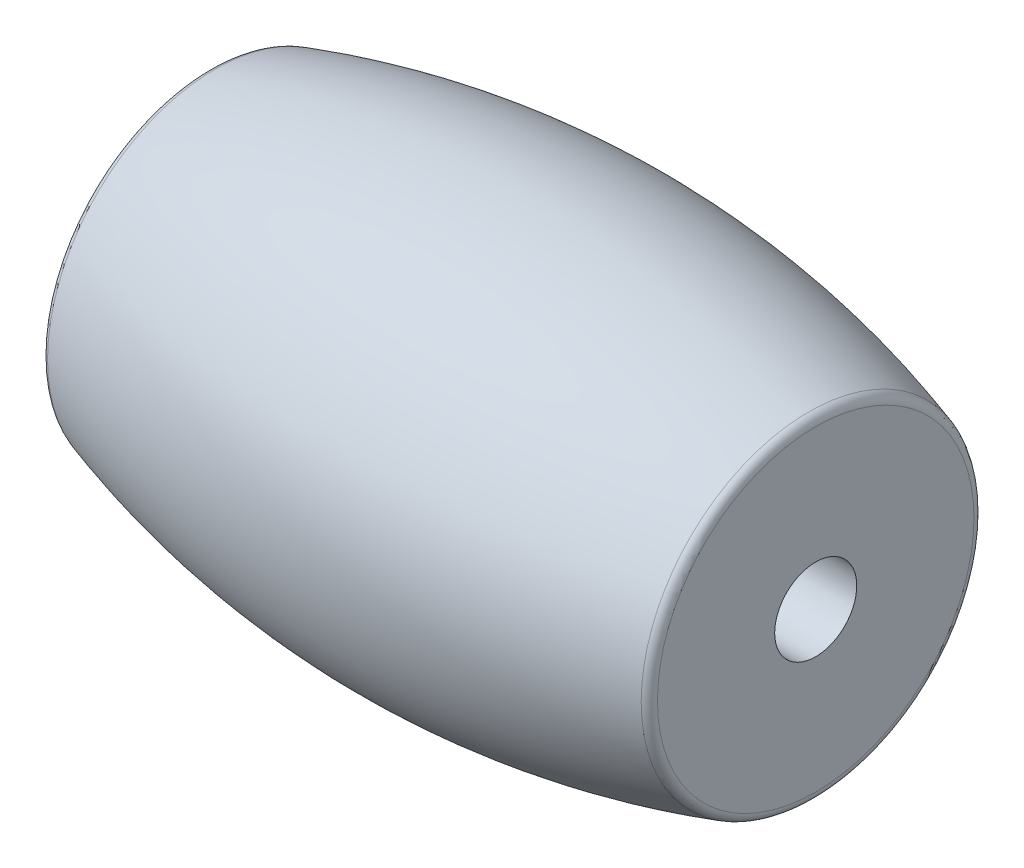
ISO-10303-21;
HEADER;
FILE_DESCRIPTION(('STEP AP214'),'2;1');
FILE_NAME('part.step','',(''),(''),'','','');
FILE_SCHEMA(('AUTOMOTIVE_DESIGN { 1 0 10303 214 1 1 1 1 }'));
ENDSEC;
DATA;
#1=APPLICATION_CONTEXT('core data for automotive mechanical design processes');
#2=APPLICATION_PROTOCOL_DEFINITION('international standard','automotive_design',2000,#1);
#3=PRODUCT_CONTEXT('',#1,'mechanical');
#4=PRODUCT('Part','Part','',(#3));
#5=PRODUCT_RELATED_PRODUCT_CATEGORY('part','',(#4));
#6=PRODUCT_DEFINITION_FORMATION('','',#4);
#7=PRODUCT_DEFINITION_CONTEXT('part definition',#1,'design');
#8=PRODUCT_DEFINITION('design','',#6,#7);
#9=PRODUCT_DEFINITION_SHAPE('','',#8);
#10=(LENGTH_UNIT() NAMED_UNIT(*) SI_UNIT(.MILLI.,.METRE.));
#11=(NAMED_UNIT(*) PLANE_ANGLE_UNIT() SI_UNIT($,.RADIAN.));
#12=(NAMED_UNIT(*) SI_UNIT($,.STERADIAN.) SOLID_ANGLE_UNIT());
#13=UNCERTAINTY_MEASURE_WITH_UNIT(LENGTH_MEASURE(1.E-05),#10,'distance_accuracy_value','');
#14=(GEOMETRIC_REPRESENTATION_CONTEXT(3) GLOBAL_UNCERTAINTY_ASSIGNED_CONTEXT((#13)) GLOBAL_UNIT_ASSIGNED_CONTEXT((#10,
#11,#12)) REPRESENTATION_CONTEXT('',''));
#15=CARTESIAN_POINT('',(0.,0.,0.));
#16=DIRECTION('',(0.,0.,1.));
#17=DIRECTION('',(1.,0.,0.));
#18=AXIS2_PLACEMENT_3D('',#15,#16,#17);
#19=CARTESIAN_POINT('',(-21.5,23.5,0.));
#20=DIRECTION('',(-1.,0.,0.));
#21=DIRECTION('',(0.,0.,1.));
#22=AXIS2_PLACEMENT_3D('',#19,#20,#21);
#23=CYLINDRICAL_SURFACE('',#22,1.25);
#24=CARTESIAN_POINT('',(9.25,23.5,0.));
#25=DIRECTION('',(-1.,0.,0.));
#26=DIRECTION('',(0.,0.,1.));
#27=AXIS2_PLACEMENT_3D('',#24,#25,#26);
#28=CIRCLE('',#27,1.25);
#29=CARTESIAN_POINT('',(9.25,23.5,1.25));
#30=VERTEX_POINT('',#29);
#31=EDGE_CURVE('E52',#30,#30,#28,.F.);
#32=ORIENTED_EDGE('',*,*,#31,.T.);
#33=EDGE_LOOP('',(#32));
#34=FACE_BOUND('',#33,.T.);
#35=CARTESIAN_POINT('',(-9.25,23.5,0.));
#36=DIRECTION('',(-1.,0.,0.));
#37=DIRECTION('',(0.,0.,1.));
#38=AXIS2_PLACEMENT_3D('',#35,#36,#37);
#39=CIRCLE('',#38,1.25);
#40=CARTESIAN_POINT('',(-9.25,23.5,1.25));
#41=VERTEX_POINT('',#40);
#42=EDGE_CURVE('E59',#41,#41,#39,.T.);
#43=ORIENTED_EDGE('',*,*,#42,.T.);
#44=EDGE_LOOP('',(#43));
#45=FACE_BOUND('',#44,.T.);
#46=ADVANCED_FACE('F16',(#34,#45),#23,.F.);
#47=CARTESIAN_POINT('',(9.25,28.5383513889643,0.));
#48=DIRECTION('',(-1.,0.,0.));
#49=DIRECTION('',(0.,0.,1.));
#50=AXIS2_PLACEMENT_3D('',#47,#48,#49);
#51=PLANE('',#50);
#52=ORIENTED_EDGE('',*,*,#31,.F.);
#53=EDGE_LOOP('',(#52));
#54=FACE_BOUND('',#53,.T.);
#55=CARTESIAN_POINT('',(9.25,23.5,0.));
#56=DIRECTION('',(-1.,0.,0.));
#57=DIRECTION('',(0.,0.,1.));
#58=AXIS2_PLACEMENT_3D('',#55,#56,#57);
#59=CIRCLE('',#58,4.81938382098029);
#60=CARTESIAN_POINT('',(9.25,23.5,4.81938382098029));
#61=VERTEX_POINT('',#60);
#62=CARTESIAN_POINT('',(9.25,23.5,-4.81938382098029));
#63=VERTEX_POINT('',#62);
#64=EDGE_CURVE('E44',#61,#63,#59,.T.);
#65=ORIENTED_EDGE('',*,*,#64,.F.);
#66=CARTESIAN_POINT('',(9.25,23.5,0.));
#67=DIRECTION('',(-1.,0.,0.));
#68=DIRECTION('',(0.,0.,-1.));
#69=AXIS2_PLACEMENT_3D('',#66,#67,#68);
#70=CIRCLE('',#69,4.81938382098029);
#71=EDGE_CURVE('E50',#63,#61,#70,.T.);
#72=ORIENTED_EDGE('',*,*,#71,.F.);
#73=EDGE_LOOP('',(#65,#72));
#74=FACE_BOUND('',#73,.T.);
#75=ADVANCED_FACE('F49',(#54,#74),#51,.F.);
#76=CARTESIAN_POINT('',(-9.25,28.5383513889643,0.));
#77=DIRECTION('',(1.,0.,0.));
#78=DIRECTION('',(0.,0.,-1.));
#79=AXIS2_PLACEMENT_3D('',#76,#77,#78);
#80=PLANE('',#79);
#81=ORIENTED_EDGE('',*,*,#42,.F.);
#82=EDGE_LOOP('',(#81));
#83=FACE_BOUND('',#82,.T.);
#84=CARTESIAN_POINT('',(-9.25,23.5,0.));
#85=DIRECTION('',(1.,0.,0.));
#86=DIRECTION('',(0.,0.,-1.));
#87=AXIS2_PLACEMENT_3D('',#84,#85,#86);
#88=CIRCLE('',#87,4.81938382098029);
#89=CARTESIAN_POINT('',(-9.25,23.5,-4.81938382098029));
#90=VERTEX_POINT('',#89);
#91=CARTESIAN_POINT('',(-9.25,23.5,4.81938382098029));
#92=VERTEX_POINT('',#91);
#93=EDGE_CURVE('E35',#90,#92,#88,.T.);
#94=ORIENTED_EDGE('',*,*,#93,.F.);
#95=CARTESIAN_POINT('',(-9.25,23.5,0.));
#96=DIRECTION('',(1.,0.,0.));
#97=DIRECTION('',(0.,0.,1.));
#98=AXIS2_PLACEMENT_3D('',#95,#96,#97);
#99=CIRCLE('',#98,4.81938382098029);
#100=EDGE_CURVE('E58',#92,#90,#99,.T.);
#101=ORIENTED_EDGE('',*,*,#100,.F.);
#102=EDGE_LOOP('',(#94,#101));
#103=FACE_BOUND('',#102,.T.);
#104=ADVANCED_FACE('F78',(#83,#103),#80,.F.);
#105=CARTESIAN_POINT('',(8.95,23.5,0.));
#106=DIRECTION('',(-1.,0.,0.));
#107=DIRECTION('',(0.,0.,1.));
#108=AXIS2_PLACEMENT_3D('',#105,#106,#107);
#109=TOROIDAL_SURFACE('',#108,4.81938382098029,0.3);
#110=ORIENTED_EDGE('',*,*,#64,.T.);
#111=ORIENTED_EDGE('',*,*,#71,.T.);
#112=EDGE_LOOP('',(#110,#111));
#113=FACE_BOUND('',#112,.T.);
#114=CARTESIAN_POINT('',(9.04040404040404,23.5,0.));
#115=DIRECTION('',(-1.,0.,0.));
#116=DIRECTION('',(0.,0.,1.));
#117=AXIS2_PLACEMENT_3D('',#114,#115,#116);
#118=CIRCLE('',#117,5.1054382030104);
#119=CARTESIAN_POINT('',(9.04040404040404,23.5,5.1054382030104));
#120=VERTEX_POINT('',#119);
#121=EDGE_CURVE('E27',#120,#120,#118,.T.);
#122=ORIENTED_EDGE('',*,*,#121,.F.);
#123=EDGE_LOOP('',(#122));
#124=FACE_BOUND('',#123,.T.);
#125=ADVANCED_FACE('F56',(#113,#124),#109,.T.);
#126=CARTESIAN_POINT('',(-8.95,23.5,0.));
#127=DIRECTION('',(1.,0.,0.));
#128=DIRECTION('',(0.,0.,-1.));
#129=AXIS2_PLACEMENT_3D('',#126,#127,#128);
#130=TOROIDAL_SURFACE('',#129,4.81938382098029,0.3);
#131=CARTESIAN_POINT('',(-9.04040404040403,23.5,0.));
#132=DIRECTION('',(-1.,0.,0.));
#133=DIRECTION('',(0.,0.,1.));
#134=AXIS2_PLACEMENT_3D('',#131,#132,#133);
#135=CIRCLE('',#134,5.1054382030104);
#136=CARTESIAN_POINT('',(-9.04040404040403,23.5,5.1054382030104));
#137=VERTEX_POINT('',#136);
#138=EDGE_CURVE('E11',#137,#137,#135,.F.);
#139=ORIENTED_EDGE('',*,*,#138,.F.);
#140=EDGE_LOOP('',(#139));
#141=FACE_BOUND('',#140,.T.);
#142=ORIENTED_EDGE('',*,*,#100,.T.);
#143=ORIENTED_EDGE('',*,*,#93,.T.);
#144=EDGE_LOOP('',(#142,#143));
#145=FACE_BOUND('',#144,.T.);
#146=ADVANCED_FACE('F77',(#141,#145),#130,.T.);
#147=CARTESIAN_POINT('',(0.,23.5,-23.5));
#148=DIRECTION('',(0.,1.,0.));
#149=DIRECTION('',(0.,0.,1.));
#150=AXIS2_PLACEMENT_3D('',#147,#148,#149);
#151=CIRCLE('',#150,30.);
#152=TRIMMED_CURVE('',#151,(PARAMETER_VALUE(-0.670785992746209)),
(PARAMETER_VALUE(0.670785992746209)),.T.,.PARAMETER.);
#153=CARTESIAN_POINT('',(0.,23.5,0.));
#154=DIRECTION('',(-1.,0.,0.));
#155=AXIS1_PLACEMENT('',#153,#154);
#156=SURFACE_OF_REVOLUTION('',#152,#155);
#157=ORIENTED_EDGE('',*,*,#121,.T.);
#158=EDGE_LOOP('',(#157));
#159=FACE_BOUND('',#158,.T.);
#160=ORIENTED_EDGE('',*,*,#138,.T.);
#161=EDGE_LOOP('',(#160));
#162=FACE_BOUND('',#161,.T.);
#163=ADVANCED_FACE('F116',(#159,#162),#156,.F.);
#164=CLOSED_SHELL('',(#46,#75,#104,#125,#146,#163));
#165=MANIFOLD_SOLID_BREP('B1',#164);
#166=ADVANCED_BREP_SHAPE_REPRESENTATION('',(#18,#165),#14);
#167=SHAPE_DEFINITION_REPRESENTATION(#9,#166);
ENDSEC;
END-ISO-10303-21;
